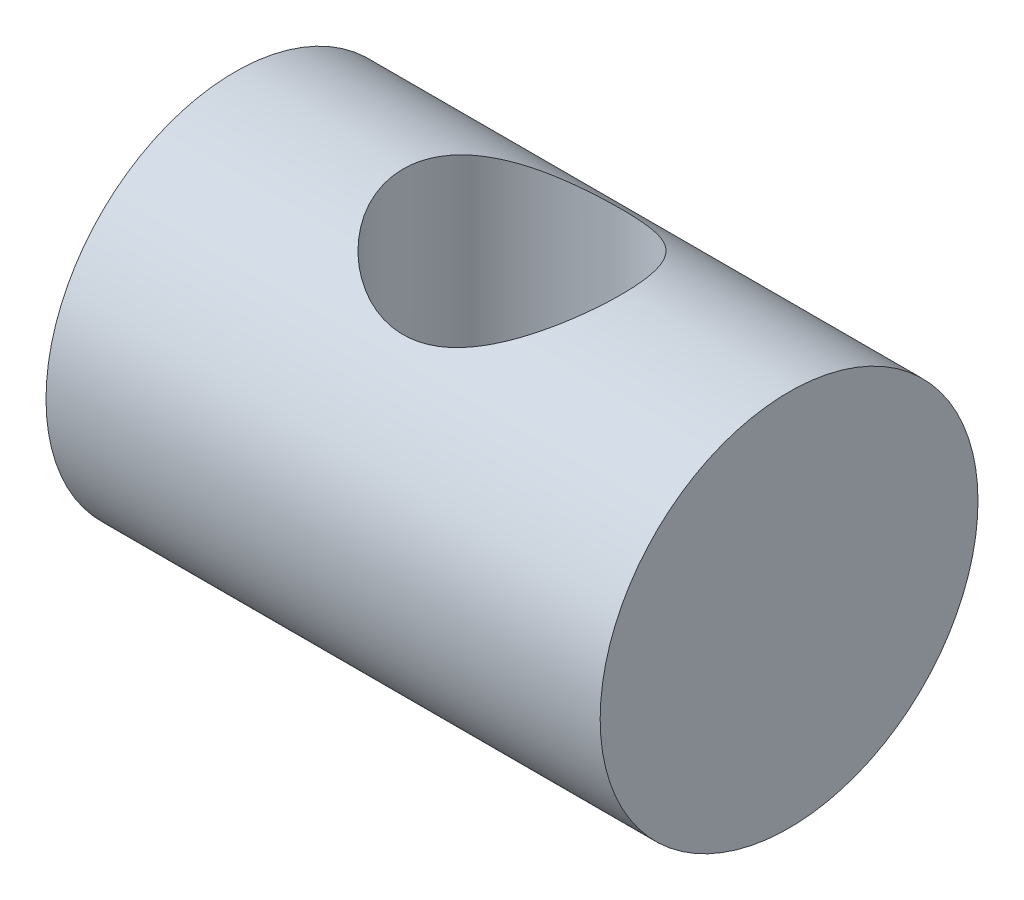
ISO-10303-21;
HEADER;
FILE_DESCRIPTION(('STEP AP214'),'2;1');
FILE_NAME('part.step','',(''),(''),'','','');
FILE_SCHEMA(('AUTOMOTIVE_DESIGN { 1 0 10303 214 1 1 1 1 }'));
ENDSEC;
DATA;
#1=APPLICATION_CONTEXT('core data for automotive mechanical design processes');
#2=APPLICATION_PROTOCOL_DEFINITION('international standard','automotive_design',2000,#1);
#3=PRODUCT_CONTEXT('',#1,'mechanical');
#4=PRODUCT('Part','Part','',(#3));
#5=PRODUCT_RELATED_PRODUCT_CATEGORY('part','',(#4));
#6=PRODUCT_DEFINITION_FORMATION('','',#4);
#7=PRODUCT_DEFINITION_CONTEXT('part definition',#1,'design');
#8=PRODUCT_DEFINITION('design','',#6,#7);
#9=PRODUCT_DEFINITION_SHAPE('','',#8);
#10=(LENGTH_UNIT() NAMED_UNIT(*) SI_UNIT(.MILLI.,.METRE.));
#11=(NAMED_UNIT(*) PLANE_ANGLE_UNIT() SI_UNIT($,.RADIAN.));
#12=(NAMED_UNIT(*) SI_UNIT($,.STERADIAN.) SOLID_ANGLE_UNIT());
#13=UNCERTAINTY_MEASURE_WITH_UNIT(LENGTH_MEASURE(1.E-05),#10,'distance_accuracy_value','');
#14=(GEOMETRIC_REPRESENTATION_CONTEXT(3) GLOBAL_UNCERTAINTY_ASSIGNED_CONTEXT((#13)) GLOBAL_UNIT_ASSIGNED_CONTEXT((#10,
#11,#12)) REPRESENTATION_CONTEXT('',''));
#15=CARTESIAN_POINT('',(0.,0.,0.));
#16=DIRECTION('',(0.,0.,1.));
#17=DIRECTION('',(1.,0.,0.));
#18=AXIS2_PLACEMENT_3D('',#15,#16,#17);
#19=CARTESIAN_POINT('',(11.,0.,0.));
#20=DIRECTION('',(-1.,0.,0.));
#21=DIRECTION('',(0.,0.,1.));
#22=AXIS2_PLACEMENT_3D('',#19,#20,#21);
#23=CYLINDRICAL_SURFACE('',#22,7.5);
#24=CARTESIAN_POINT('',(11.,0.,0.));
#25=DIRECTION('',(1.,0.,0.));
#26=DIRECTION('',(0.,0.,-1.));
#27=AXIS2_PLACEMENT_3D('',#24,#25,#26);
#28=CIRCLE('',#27,7.5);
#29=CARTESIAN_POINT('',(11.,0.,-7.5));
#30=VERTEX_POINT('',#29);
#31=EDGE_CURVE('E48',#30,#30,#28,.T.);
#32=ORIENTED_EDGE('',*,*,#31,.F.);
#33=EDGE_LOOP('',(#32));
#34=FACE_BOUND('',#33,.T.);
#35=CARTESIAN_POINT('',(-11.,0.,0.));
#36=DIRECTION('',(1.,0.,0.));
#37=DIRECTION('',(0.,0.,-1.));
#38=AXIS2_PLACEMENT_3D('',#35,#36,#37);
#39=CIRCLE('',#38,7.5);
#40=CARTESIAN_POINT('',(-11.,0.,-7.5));
#41=VERTEX_POINT('',#40);
#42=EDGE_CURVE('E55',#41,#41,#39,.T.);
#43=ORIENTED_EDGE('',*,*,#42,.T.);
#44=EDGE_LOOP('',(#43));
#45=FACE_BOUND('',#44,.T.);
#46=CARTESIAN_POINT('',(-4.325,7.5,0.));
#47=CARTESIAN_POINT('',(-4.3249989733802,7.49999907371893,0.111406500887851));
#48=CARTESIAN_POINT('',(-4.32068859836457,7.49751115938007,0.222842892540437));
#49=CARTESIAN_POINT('',(-4.30350102412019,7.48761969246633,0.444879631316651));
#50=CARTESIAN_POINT('',(-4.29061875288578,7.480213229583,0.555479444226283));
#51=CARTESIAN_POINT('',(-4.25642100438024,7.46064981867596,0.775163788120663));
#52=CARTESIAN_POINT('',(-4.23508960607016,7.44848390275437,0.884245053622962));
#53=CARTESIAN_POINT('',(-4.18427125631014,7.41970823139235,1.09990783567033));
#54=CARTESIAN_POINT('',(-4.15478083359739,7.40309658461103,1.20648826725006));
#55=CARTESIAN_POINT('',(-4.05490261134948,7.34734724354541,1.52029836681879));
#56=CARTESIAN_POINT('',(-3.97290019691425,7.30217219292593,1.72289940219435));
#57=CARTESIAN_POINT('',(-3.78114541682111,7.19964574033503,2.11080331969416));
#58=CARTESIAN_POINT('',(-3.67139990444702,7.14229734606364,2.29611045841526));
#59=CARTESIAN_POINT('',(-3.41827702837635,7.01541985041362,2.65961569799091));
#60=CARTESIAN_POINT('',(-3.27302886163196,6.94530705637764,2.83630634416333));
#61=CARTESIAN_POINT('',(-2.95717678591103,6.80216407115391,3.16428010784511));
#62=CARTESIAN_POINT('',(-2.78654278497047,6.72913049387963,3.31553261179296));
#63=CARTESIAN_POINT('',(-2.40233740783109,6.57882274709114,3.60535370550076));
#64=CARTESIAN_POINT('',(-2.1861014917045,6.50197979950172,3.74064276201399));
#65=CARTESIAN_POINT('',(-1.72947061407631,6.36305824545711,3.97238490297447));
#66=CARTESIAN_POINT('',(-1.48911343524022,6.30095704617294,4.06889757441958));
#67=CARTESIAN_POINT('',(-1.04638253437091,6.213163412007,4.20136131691582));
#68=CARTESIAN_POINT('',(-0.847626711032953,6.18242334964983,4.24605184016597));
#69=CARTESIAN_POINT('',(-0.443882124343052,6.14013704658351,4.30698885572666));
#70=CARTESIAN_POINT('',(-0.238900482972013,6.12856965746584,4.3232666896954));
#71=CARTESIAN_POINT('',(0.171706342420846,6.12630753286495,4.32647232708883));
#72=CARTESIAN_POINT('',(0.377332029203728,6.13564335621423,4.3133571602599));
#73=CARTESIAN_POINT('',(0.782901106469855,6.17385057241012,4.25847806613498));
#74=CARTESIAN_POINT('',(0.982840416633027,6.20273564197712,4.21669408175269));
#75=CARTESIAN_POINT('',(1.37104586724758,6.27597746316576,4.10687005823836));
#76=CARTESIAN_POINT('',(1.55936878530216,6.32025053356133,4.03897182196334));
#77=CARTESIAN_POINT('',(1.92252388560492,6.41949344192888,3.87929335793174));
#78=CARTESIAN_POINT('',(2.09735091075817,6.47446734095547,3.78750405884254));
#79=CARTESIAN_POINT('',(2.45878421720345,6.59975164423955,3.56539755956836));
#80=CARTESIAN_POINT('',(2.64266704629201,6.6711013835073,3.43123934856656));
#81=CARTESIAN_POINT('',(2.98716825419669,6.81491157354442,3.13591029667488));
#82=CARTESIAN_POINT('',(3.14776610289422,6.88737294293583,2.97471588505287));
#83=CARTESIAN_POINT('',(3.37761029414531,6.99624049708208,2.70436678176851));
#84=CARTESIAN_POINT('',(3.45594890008921,7.03447653409249,2.6035409956041));
#85=CARTESIAN_POINT('',(3.60379352980606,7.10827649286381,2.39471238276981));
#86=CARTESIAN_POINT('',(3.67330310750318,7.1438414874207,2.28671247071255));
#87=CARTESIAN_POINT('',(3.80286283151662,7.21131637121574,2.06408548548965));
#88=CARTESIAN_POINT('',(3.86291257481372,7.24322610471229,1.94945813025798));
#89=CARTESIAN_POINT('',(3.97283728720206,7.30244252554973,1.7143546534007));
#90=CARTESIAN_POINT('',(4.02271844786709,7.32975201217621,1.59388214650684));
#91=CARTESIAN_POINT('',(4.10865157550395,7.37727596734226,1.35627037792046));
#92=CARTESIAN_POINT('',(4.14541158735487,7.39784580694793,1.23945840238794));
#93=CARTESIAN_POINT('',(4.20901550313488,7.43367306374195,1.00242651846224));
#94=CARTESIAN_POINT('',(4.23586478790302,7.44893336338393,0.882208497606646));
#95=CARTESIAN_POINT('',(4.27924961847356,7.47368950869715,0.639411252040747));
#96=CARTESIAN_POINT('',(4.29579133073627,7.4831888007749,0.516833484378583));
#97=CARTESIAN_POINT('',(4.31831136974123,7.49613913257082,0.27039879821799));
#98=CARTESIAN_POINT('',(4.32429093001924,7.49959087857122,0.146542030791412));
#99=CARTESIAN_POINT('',(4.32550963796099,7.50029408804333,-0.085833070985016));
#100=CARTESIAN_POINT('',(4.32199092425131,7.49826262247724,-0.194345171893942));
#101=CARTESIAN_POINT('',(4.30682625094602,7.48953193986053,-0.410645867706769));
#102=CARTESIAN_POINT('',(4.29517775586701,7.48283126659731,-0.518434226301602));
#103=CARTESIAN_POINT('',(4.26390228069611,7.46492278125311,-0.732425051834486));
#104=CARTESIAN_POINT('',(4.24427844239217,7.45371674402328,-0.838628126215359));
#105=CARTESIAN_POINT('',(4.19729645149344,7.42706571842023,-1.04878103070637));
#106=CARTESIAN_POINT('',(4.16993531626437,7.41161909541969,-1.15272997520625));
#107=CARTESIAN_POINT('',(4.07748631858753,7.3598664228656,-1.45750211231127));
#108=CARTESIAN_POINT('',(4.00158854301784,7.31788472307086,-1.65420907552612));
#109=CARTESIAN_POINT('',(3.8236101425819,7.22210270757667,-2.03208521370951));
#110=CARTESIAN_POINT('',(3.72152343815626,7.16829964805585,-2.2132507678105));
#111=CARTESIAN_POINT('',(3.48206959388143,7.04680299361959,-2.57540308064993));
#112=CARTESIAN_POINT('',(3.3421340988746,6.97824607320144,-2.75440267605476));
#113=CARTESIAN_POINT('',(3.03686608468419,6.83729385071479,-3.08775932490198));
#114=CARTESIAN_POINT('',(2.87150425798014,6.76489418319811,-3.24208751688406));
#115=CARTESIAN_POINT('',(2.49770149634377,6.61439995380472,-3.5398597240135));
#116=CARTESIAN_POINT('',(2.28649305737191,6.53660865420524,-3.68000815041635));
#117=CARTESIAN_POINT('',(1.83946846158347,6.3940161489407,-3.92255339255094));
#118=CARTESIAN_POINT('',(1.60368456711335,6.32919823064186,-4.02499892274799));
#119=CARTESIAN_POINT('',(1.16555226783374,6.23438074096147,-4.16993232356836));
#120=CARTESIAN_POINT('',(0.966875394313057,6.19989544432152,-4.22056637721176));
#121=CARTESIAN_POINT('',(0.562122409120232,6.14981442628138,-4.29322631230437));
#122=CARTESIAN_POINT('',(0.356055358752716,6.13419633517765,-4.31528607480841));
#123=CARTESIAN_POINT('',(-0.0581241257328538,6.12411769655751,-4.32958160382325));
#124=CARTESIAN_POINT('',(-0.266240166470231,6.12970574586563,-4.32174886727658));
#125=CARTESIAN_POINT('',(-0.67770484963405,6.16128819572146,-4.27659212789337));
#126=CARTESIAN_POINT('',(-0.88105042947261,6.18729535482618,-4.23924968629049));
#127=CARTESIAN_POINT('',(-1.27312162967806,6.25529053497131,-4.13822376436224));
#128=CARTESIAN_POINT('',(-1.46207307501346,6.29690638554096,-4.07515093884477));
#129=CARTESIAN_POINT('',(-1.82711251335806,6.39152306101793,-3.92508394534691));
#130=CARTESIAN_POINT('',(-2.00319581248502,6.44452801279519,-3.83808110305462));
#131=CARTESIAN_POINT('',(-2.36652648524543,6.56590465398132,-3.62710025342884));
#132=CARTESIAN_POINT('',(-2.55129318305331,6.63538520723815,-3.49948580935152));
#133=CARTESIAN_POINT('',(-2.89856988761662,6.77649413517602,-3.21776754939332));
#134=CARTESIAN_POINT('',(-3.06105972519319,6.84812438558694,-3.06364000981894));
#135=CARTESIAN_POINT('',(-3.38096517407782,6.99661737709406,-2.70902354705243));
#136=CARTESIAN_POINT('',(-3.53490489253099,7.0729298791204,-2.50510345809821));
#137=CARTESIAN_POINT('',(-3.73811871449472,7.17736526257262,-2.17911586766424));
#138=CARTESIAN_POINT('',(-3.8012567981829,7.21051402032444,-2.06706218517182));
#139=CARTESIAN_POINT('',(-3.91769934814046,7.27257211472626,-1.83680974238474));
#140=CARTESIAN_POINT('',(-3.97100651132283,7.30148261360869,-1.71861267884091));
#141=CARTESIAN_POINT('',(-4.05851894228458,7.34948068691731,-1.49849076143778));
#142=CARTESIAN_POINT('',(-4.09443539700685,7.36940059217211,-1.39742248727658));
#143=CARTESIAN_POINT('',(-4.15880634997922,7.4053582666016,-1.19226874302579));
#144=CARTESIAN_POINT('',(-4.18726217442652,7.42139672570078,-1.08818381283327));
#145=CARTESIAN_POINT('',(-4.23633872171372,7.44919680945245,-0.877890450242719));
#146=CARTESIAN_POINT('',(-4.25697806642095,7.4609685960494,-0.771687707486218));
#147=CARTESIAN_POINT('',(-4.29026045883077,7.48000815947775,-0.557678157221721));
#148=CARTESIAN_POINT('',(-4.30290781748618,7.48727836446211,-0.449872246655588));
#149=CARTESIAN_POINT('',(-4.31598419820213,7.49480375007878,-0.284875692368657));
#150=CARTESIAN_POINT('',(-4.3193634122208,7.49675074982816,-0.227977447808558));
#151=CARTESIAN_POINT('',(-4.3238717179394,7.49934919366633,-0.114055423241987));
#152=CARTESIAN_POINT('',(-4.32500052555101,7.50000047418523,-0.0570316282957167));
#153=CARTESIAN_POINT('',(-4.325,7.5,0.));
#154=B_SPLINE_CURVE_WITH_KNOTS('',3,(#46,#47,#48,#49,#50,#51,#52,#53,#54,#55,#56,#57,#58,#59,
#60,#61,#62,#63,#64,#65,#66,#67,#68,#69,#70,#71,#72,#73,#74,#75,#76,#77,#78,#79,#80,#81,#82,#83,
#84,#85,#86,#87,#88,#89,#90,#91,#92,#93,#94,#95,#96,#97,#98,#99,#100,#101,#102,#103,#104,#105,
#106,#107,#108,#109,#110,#111,#112,#113,#114,#115,#116,#117,#118,#119,#120,#121,#122,#123,#124,
#125,#126,#127,#128,#129,#130,#131,#132,#133,#134,#135,#136,#137,#138,#139,#140,#141,#142,#143,
#144,#145,#146,#147,#148,#149,#150,#151,#152,#153),.UNSPECIFIED.,.T.,.F.,(4,2,2,2,2,2,2,2,2,2,2,
2,2,2,2,2,2,2,2,2,2,2,2,2,2,2,2,2,2,2,2,2,2,2,2,2,2,2,2,2,2,2,2,2,2,2,2,2,2,2,2,2,2,4),(0.,
0.334160333327935,0.66851856592889,1.00350986399764,1.33864390410495,2.00498858168456,
2.6711688149632,3.38599956869466,4.10168452431313,4.89693476889824,5.6909582487982,
6.30637064537142,6.92110375871574,7.53673614961821,8.15279968489882,8.76556411954174,
9.37856155844609,10.0914571286575,10.8049774780742,11.2043968378923,11.6036549075749,
12.0029299823317,12.4019612105111,12.7739538595139,13.1457442441442,13.5173119927181,
13.8888363436573,14.2142005931158,14.5396663612338,14.8650040402186,15.1904673043027,
15.8324932570007,16.4746683861923,17.1837835945138,17.8937223740057,18.6853487710165,
19.475948716859,20.0970237407422,20.717361668561,21.3391220446761,21.9612712273818,
22.5694425512541,23.1778346203181,23.8802566401422,24.5833104820581,25.3787985092113,
25.7768027468362,26.1746976371538,26.5016428739296,26.8285299536505,27.1546332886709,
27.4805605699776,27.6516035738048,27.8226681685066),.UNSPECIFIED.);
#155=CARTESIAN_POINT('',(-4.325,7.5,0.));
#156=VERTEX_POINT('',#155);
#157=EDGE_CURVE('E10',#156,#156,#154,.T.);
#158=ORIENTED_EDGE('',*,*,#157,.F.);
#159=EDGE_LOOP('',(#158));
#160=FACE_BOUND('',#159,.T.);
#161=ADVANCED_FACE('F36',(#34,#45,#160),#23,.T.);
#162=CARTESIAN_POINT('',(11.,0.,0.));
#163=DIRECTION('',(1.,0.,0.));
#164=DIRECTION('',(0.,0.,-1.));
#165=AXIS2_PLACEMENT_3D('',#162,#163,#164);
#166=PLANE('',#165);
#167=ORIENTED_EDGE('',*,*,#31,.T.);
#168=EDGE_LOOP('',(#167));
#169=FACE_BOUND('',#168,.T.);
#170=ADVANCED_FACE('F79',(#169),#166,.T.);
#171=CARTESIAN_POINT('',(-11.,0.,0.));
#172=DIRECTION('',(1.,0.,0.));
#173=DIRECTION('',(0.,0.,-1.));
#174=AXIS2_PLACEMENT_3D('',#171,#172,#173);
#175=PLANE('',#174);
#176=ORIENTED_EDGE('',*,*,#42,.F.);
#177=EDGE_LOOP('',(#176));
#178=FACE_BOUND('',#177,.T.);
#179=ADVANCED_FACE('F73',(#178),#175,.F.);
#180=CARTESIAN_POINT('',(0.,7.5,0.));
#181=DIRECTION('',(0.,-1.,0.));
#182=DIRECTION('',(0.,0.,-1.));
#183=AXIS2_PLACEMENT_3D('',#180,#181,#182);
#184=CYLINDRICAL_SURFACE('',#183,4.325);
#185=CARTESIAN_POINT('',(0.,0.,0.));
#186=DIRECTION('',(0.,1.,0.));
#187=DIRECTION('',(0.,0.,1.));
#188=AXIS2_PLACEMENT_3D('',#185,#186,#187);
#189=CIRCLE('',#188,4.325);
#190=CARTESIAN_POINT('',(0.,0.,4.325));
#191=VERTEX_POINT('',#190);
#192=EDGE_CURVE('E62',#191,#191,#189,.T.);
#193=ORIENTED_EDGE('',*,*,#192,.F.);
#194=EDGE_LOOP('',(#193));
#195=FACE_BOUND('',#194,.T.);
#196=ORIENTED_EDGE('',*,*,#157,.T.);
#197=EDGE_LOOP('',(#196));
#198=FACE_BOUND('',#197,.T.);
#199=ADVANCED_FACE('F71',(#195,#198),#184,.F.);
#200=CARTESIAN_POINT('',(0.,0.,0.));
#201=DIRECTION('',(0.,1.,0.));
#202=DIRECTION('',(0.,0.,1.));
#203=AXIS2_PLACEMENT_3D('',#200,#201,#202);
#204=PLANE('',#203);
#205=ORIENTED_EDGE('',*,*,#192,.T.);
#206=EDGE_LOOP('',(#205));
#207=FACE_BOUND('',#206,.T.);
#208=ADVANCED_FACE('F69',(#207),#204,.T.);
#209=CLOSED_SHELL('',(#161,#170,#179,#199,#208));
#210=MANIFOLD_SOLID_BREP('B2',#209);
#211=ADVANCED_BREP_SHAPE_REPRESENTATION('',(#18,#210),#14);
#212=SHAPE_DEFINITION_REPRESENTATION(#9,#211);
ENDSEC;
END-ISO-10303-21;
